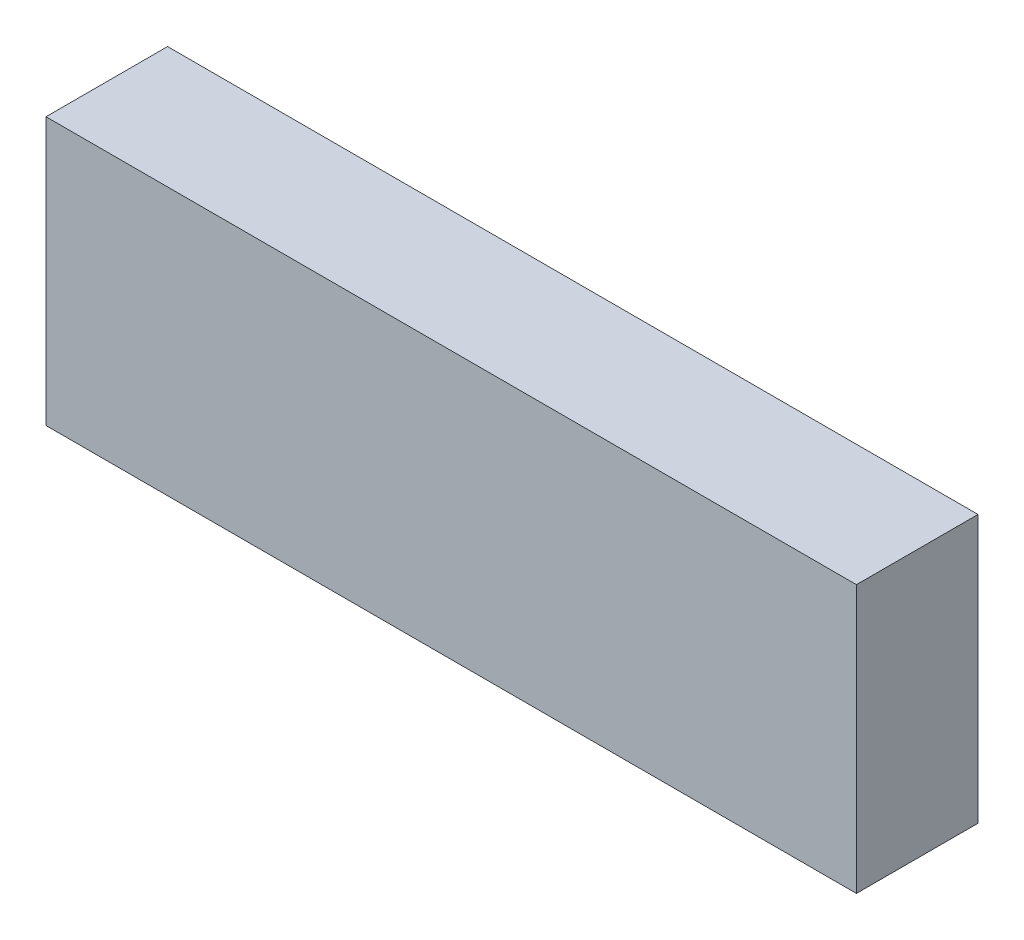
ISO-10303-21;
HEADER;
FILE_DESCRIPTION(('STEP AP214'),'2;1');
FILE_NAME('part.step','',(''),(''),'','','');
FILE_SCHEMA(('AUTOMOTIVE_DESIGN { 1 0 10303 214 1 1 1 1 }'));
ENDSEC;
DATA;
#1=APPLICATION_CONTEXT('core data for automotive mechanical design processes');
#2=APPLICATION_PROTOCOL_DEFINITION('international standard','automotive_design',2000,#1);
#3=PRODUCT_CONTEXT('',#1,'mechanical');
#4=PRODUCT('Part','Part','',(#3));
#5=PRODUCT_RELATED_PRODUCT_CATEGORY('part','',(#4));
#6=PRODUCT_DEFINITION_FORMATION('','',#4);
#7=PRODUCT_DEFINITION_CONTEXT('part definition',#1,'design');
#8=PRODUCT_DEFINITION('design','',#6,#7);
#9=PRODUCT_DEFINITION_SHAPE('','',#8);
#10=(LENGTH_UNIT() NAMED_UNIT(*) SI_UNIT(.MILLI.,.METRE.));
#11=(NAMED_UNIT(*) PLANE_ANGLE_UNIT() SI_UNIT($,.RADIAN.));
#12=(NAMED_UNIT(*) SI_UNIT($,.STERADIAN.) SOLID_ANGLE_UNIT());
#13=UNCERTAINTY_MEASURE_WITH_UNIT(LENGTH_MEASURE(1.E-05),#10,'distance_accuracy_value','');
#14=(GEOMETRIC_REPRESENTATION_CONTEXT(3) GLOBAL_UNCERTAINTY_ASSIGNED_CONTEXT((#13)) GLOBAL_UNIT_ASSIGNED_CONTEXT((#10,
#11,#12)) REPRESENTATION_CONTEXT('',''));
#15=CARTESIAN_POINT('',(0.,0.,0.));
#16=DIRECTION('',(0.,0.,1.));
#17=DIRECTION('',(1.,0.,0.));
#18=AXIS2_PLACEMENT_3D('',#15,#16,#17);
#19=CARTESIAN_POINT('',(-50.,-16.5,15.));
#20=DIRECTION('',(1.,0.,0.));
#21=DIRECTION('',(0.,0.,-1.));
#22=AXIS2_PLACEMENT_3D('',#19,#20,#21);
#23=PLANE('',#22);
#24=DIRECTION('',(0.,-1.,0.));
#25=VECTOR('',#24,1.);
#26=CARTESIAN_POINT('',(-50.,-16.5,0.));
#27=LINE('',#26,#25);
#28=CARTESIAN_POINT('',(-50.,16.5,0.));
#29=VERTEX_POINT('',#28);
#30=CARTESIAN_POINT('',(-50.,-16.5,0.));
#31=VERTEX_POINT('',#30);
#32=EDGE_CURVE('E99',#29,#31,#27,.T.);
#33=ORIENTED_EDGE('',*,*,#32,.T.);
#34=DIRECTION('',(0.,0.,-1.));
#35=VECTOR('',#34,1.);
#36=CARTESIAN_POINT('',(-50.,-16.5,15.));
#37=LINE('',#36,#35);
#38=CARTESIAN_POINT('',(-50.,-16.5,15.));
#39=VERTEX_POINT('',#38);
#40=EDGE_CURVE('E11',#39,#31,#37,.T.);
#41=ORIENTED_EDGE('',*,*,#40,.F.);
#42=DIRECTION('',(0.,-1.,0.));
#43=VECTOR('',#42,1.);
#44=CARTESIAN_POINT('',(-50.,-16.5,15.));
#45=LINE('',#44,#43);
#46=CARTESIAN_POINT('',(-50.,16.5,15.));
#47=VERTEX_POINT('',#46);
#48=EDGE_CURVE('E87',#47,#39,#45,.T.);
#49=ORIENTED_EDGE('',*,*,#48,.F.);
#50=DIRECTION('',(0.,0.,-1.));
#51=VECTOR('',#50,1.);
#52=CARTESIAN_POINT('',(-50.,16.5,15.));
#53=LINE('',#52,#51);
#54=EDGE_CURVE('E95',#47,#29,#53,.T.);
#55=ORIENTED_EDGE('',*,*,#54,.T.);
#56=EDGE_LOOP('',(#33,#41,#49,#55));
#57=FACE_BOUND('',#56,.T.);
#58=ADVANCED_FACE('F36',(#57),#23,.F.);
#59=CARTESIAN_POINT('',(50.,-16.5,15.));
#60=DIRECTION('',(0.,1.,0.));
#61=DIRECTION('',(-1.,0.,0.));
#62=AXIS2_PLACEMENT_3D('',#59,#60,#61);
#63=PLANE('',#62);
#64=DIRECTION('',(1.,0.,0.));
#65=VECTOR('',#64,1.);
#66=CARTESIAN_POINT('',(50.,-16.5,0.));
#67=LINE('',#66,#65);
#68=CARTESIAN_POINT('',(50.,-16.5,0.));
#69=VERTEX_POINT('',#68);
#70=EDGE_CURVE('E91',#31,#69,#67,.T.);
#71=ORIENTED_EDGE('',*,*,#70,.T.);
#72=DIRECTION('',(0.,0.,-1.));
#73=VECTOR('',#72,1.);
#74=CARTESIAN_POINT('',(50.,-16.5,15.));
#75=LINE('',#74,#73);
#76=CARTESIAN_POINT('',(50.,-16.5,15.));
#77=VERTEX_POINT('',#76);
#78=EDGE_CURVE('E44',#77,#69,#75,.T.);
#79=ORIENTED_EDGE('',*,*,#78,.F.);
#80=DIRECTION('',(1.,0.,0.));
#81=VECTOR('',#80,1.);
#82=CARTESIAN_POINT('',(50.,-16.5,15.));
#83=LINE('',#82,#81);
#84=EDGE_CURVE('E82',#39,#77,#83,.T.);
#85=ORIENTED_EDGE('',*,*,#84,.F.);
#86=ORIENTED_EDGE('',*,*,#40,.T.);
#87=EDGE_LOOP('',(#71,#79,#85,#86));
#88=FACE_BOUND('',#87,.T.);
#89=ADVANCED_FACE('F90',(#88),#63,.F.);
#90=CARTESIAN_POINT('',(50.,-16.5,15.));
#91=DIRECTION('',(-1.,0.,0.));
#92=DIRECTION('',(0.,0.,1.));
#93=AXIS2_PLACEMENT_3D('',#90,#91,#92);
#94=PLANE('',#93);
#95=DIRECTION('',(0.,1.,0.));
#96=VECTOR('',#95,1.);
#97=CARTESIAN_POINT('',(50.,-16.5,0.));
#98=LINE('',#97,#96);
#99=CARTESIAN_POINT('',(50.,16.5,0.));
#100=VERTEX_POINT('',#99);
#101=EDGE_CURVE('E69',#69,#100,#98,.T.);
#102=ORIENTED_EDGE('',*,*,#101,.T.);
#103=DIRECTION('',(0.,0.,-1.));
#104=VECTOR('',#103,1.);
#105=CARTESIAN_POINT('',(50.,16.5,15.));
#106=LINE('',#105,#104);
#107=CARTESIAN_POINT('',(50.,16.5,15.));
#108=VERTEX_POINT('',#107);
#109=EDGE_CURVE('E92',#108,#100,#106,.T.);
#110=ORIENTED_EDGE('',*,*,#109,.F.);
#111=DIRECTION('',(0.,1.,0.));
#112=VECTOR('',#111,1.);
#113=CARTESIAN_POINT('',(50.,-16.5,15.));
#114=LINE('',#113,#112);
#115=EDGE_CURVE('E85',#77,#108,#114,.T.);
#116=ORIENTED_EDGE('',*,*,#115,.F.);
#117=ORIENTED_EDGE('',*,*,#78,.T.);
#118=EDGE_LOOP('',(#102,#110,#116,#117));
#119=FACE_BOUND('',#118,.T.);
#120=ADVANCED_FACE('F93',(#119),#94,.F.);
#121=CARTESIAN_POINT('',(50.,16.5,15.));
#122=DIRECTION('',(0.,-1.,0.));
#123=DIRECTION('',(1.,0.,0.));
#124=AXIS2_PLACEMENT_3D('',#121,#122,#123);
#125=PLANE('',#124);
#126=DIRECTION('',(-1.,0.,0.));
#127=VECTOR('',#126,1.);
#128=CARTESIAN_POINT('',(50.,16.5,0.));
#129=LINE('',#128,#127);
#130=EDGE_CURVE('E75',#100,#29,#129,.T.);
#131=ORIENTED_EDGE('',*,*,#130,.T.);
#132=ORIENTED_EDGE('',*,*,#54,.F.);
#133=DIRECTION('',(-1.,0.,0.));
#134=VECTOR('',#133,1.);
#135=CARTESIAN_POINT('',(50.,16.5,15.));
#136=LINE('',#135,#134);
#137=EDGE_CURVE('E52',#108,#47,#136,.T.);
#138=ORIENTED_EDGE('',*,*,#137,.F.);
#139=ORIENTED_EDGE('',*,*,#109,.T.);
#140=EDGE_LOOP('',(#131,#132,#138,#139));
#141=FACE_BOUND('',#140,.T.);
#142=ADVANCED_FACE('F106',(#141),#125,.F.);
#143=CARTESIAN_POINT('',(0.,0.,15.));
#144=DIRECTION('',(0.,0.,1.));
#145=DIRECTION('',(1.,0.,0.));
#146=AXIS2_PLACEMENT_3D('',#143,#144,#145);
#147=PLANE('',#146);
#148=ORIENTED_EDGE('',*,*,#48,.T.);
#149=ORIENTED_EDGE('',*,*,#84,.T.);
#150=ORIENTED_EDGE('',*,*,#115,.T.);
#151=ORIENTED_EDGE('',*,*,#137,.T.);
#152=EDGE_LOOP('',(#148,#149,#150,#151));
#153=FACE_BOUND('',#152,.T.);
#154=ADVANCED_FACE('F83',(#153),#147,.T.);
#155=CARTESIAN_POINT('',(0.,0.,0.));
#156=DIRECTION('',(0.,0.,1.));
#157=DIRECTION('',(1.,0.,0.));
#158=AXIS2_PLACEMENT_3D('',#155,#156,#157);
#159=PLANE('',#158);
#160=ORIENTED_EDGE('',*,*,#32,.F.);
#161=ORIENTED_EDGE('',*,*,#130,.F.);
#162=ORIENTED_EDGE('',*,*,#101,.F.);
#163=ORIENTED_EDGE('',*,*,#70,.F.);
#164=EDGE_LOOP('',(#160,#161,#162,#163));
#165=FACE_BOUND('',#164,.T.);
#166=ADVANCED_FACE('F109',(#165),#159,.F.);
#167=CLOSED_SHELL('',(#58,#89,#120,#142,#154,#166));
#168=MANIFOLD_SOLID_BREP('B2',#167);
#169=ADVANCED_BREP_SHAPE_REPRESENTATION('',(#18,#168),#14);
#170=SHAPE_DEFINITION_REPRESENTATION(#9,#169);
ENDSEC;
END-ISO-10303-21;
